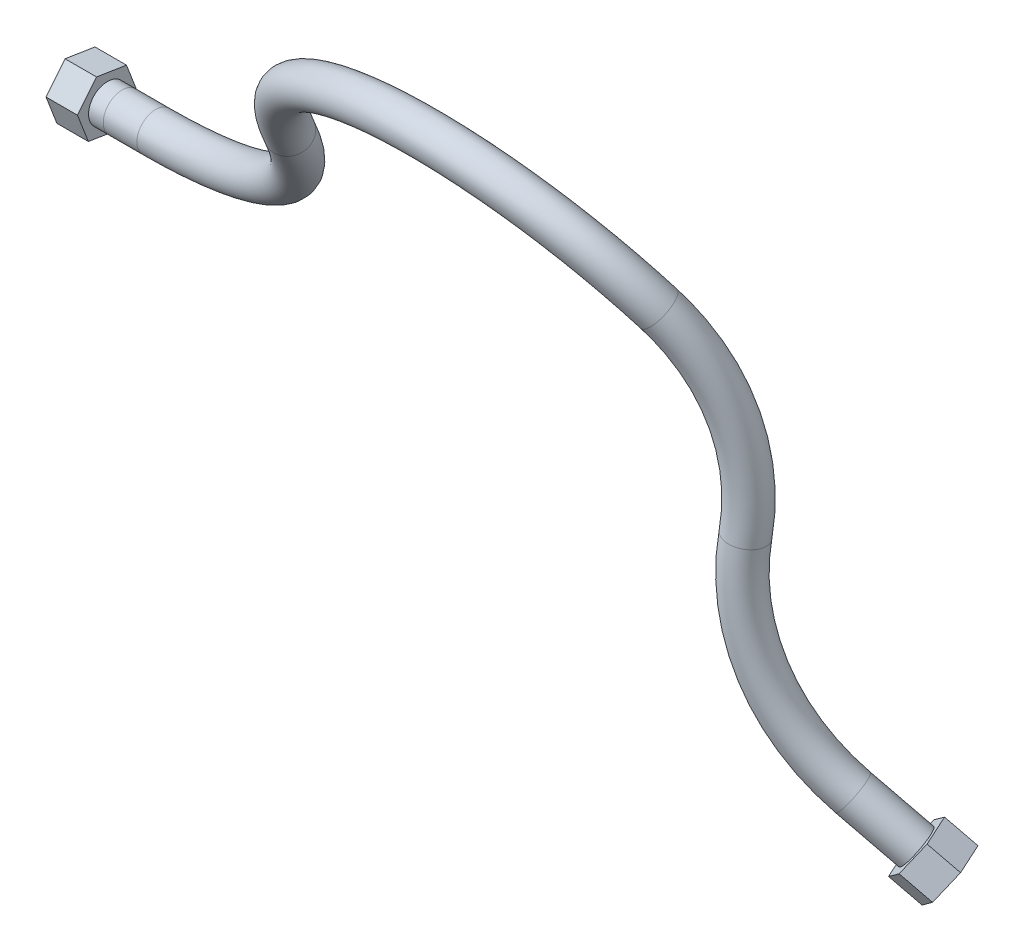
ISO-10303-21;
HEADER;
FILE_DESCRIPTION(('STEP AP214'),'2;1');
FILE_NAME('part.step','',(''),(''),'','','');
FILE_SCHEMA(('AUTOMOTIVE_DESIGN { 1 0 10303 214 1 1 1 1 }'));
ENDSEC;
DATA;
#1=APPLICATION_CONTEXT('core data for automotive mechanical design processes');
#2=APPLICATION_PROTOCOL_DEFINITION('international standard','automotive_design',2000,#1);
#3=PRODUCT_CONTEXT('',#1,'mechanical');
#4=PRODUCT('Part','Part','',(#3));
#5=PRODUCT_RELATED_PRODUCT_CATEGORY('part','',(#4));
#6=PRODUCT_DEFINITION_FORMATION('','',#4);
#7=PRODUCT_DEFINITION_CONTEXT('part definition',#1,'design');
#8=PRODUCT_DEFINITION('design','',#6,#7);
#9=PRODUCT_DEFINITION_SHAPE('','',#8);
#10=(LENGTH_UNIT() NAMED_UNIT(*) SI_UNIT(.MILLI.,.METRE.));
#11=(NAMED_UNIT(*) PLANE_ANGLE_UNIT() SI_UNIT($,.RADIAN.));
#12=(NAMED_UNIT(*) SI_UNIT($,.STERADIAN.) SOLID_ANGLE_UNIT());
#13=UNCERTAINTY_MEASURE_WITH_UNIT(LENGTH_MEASURE(1.E-05),#10,'distance_accuracy_value','');
#14=(GEOMETRIC_REPRESENTATION_CONTEXT(3) GLOBAL_UNCERTAINTY_ASSIGNED_CONTEXT((#13)) GLOBAL_UNIT_ASSIGNED_CONTEXT((#10,
#11,#12)) REPRESENTATION_CONTEXT('',''));
#15=CARTESIAN_POINT('',(0.,0.,0.));
#16=DIRECTION('',(0.,0.,1.));
#17=DIRECTION('',(1.,0.,0.));
#18=AXIS2_PLACEMENT_3D('',#15,#16,#17);
#19=CARTESIAN_POINT('',(-27.94,9.97686192185297,12.3481922236528));
#20=DIRECTION('',(0.,-0.628463743108848,-0.7778388802301));
#21=DIRECTION('',(0.,0.7778388802301,-0.628463743108848));
#22=AXIS2_PLACEMENT_3D('',#19,#20,#21);
#23=PLANE('',#22);
#24=DIRECTION('',(0.,0.7778388802301,-0.628463743108848));
#25=VECTOR('',#24,1.);
#26=CARTESIAN_POINT('',(-8.89,9.97686192185297,12.3481922236528));
#27=LINE('',#26,#25);
#28=CARTESIAN_POINT('',(-8.89,2.84762981752179,18.1083361399024));
#29=VERTEX_POINT('',#28);
#30=CARTESIAN_POINT('',(-8.89,17.1060940261842,6.5880483074033));
#31=VERTEX_POINT('',#30);
#32=EDGE_CURVE('E154',#29,#31,#27,.T.);
#33=ORIENTED_EDGE('',*,*,#32,.T.);
#34=DIRECTION('',(1.,0.,0.));
#35=VECTOR('',#34,1.);
#36=CARTESIAN_POINT('',(-27.94,17.1060940261842,6.5880483074033));
#37=LINE('',#36,#35);
#38=CARTESIAN_POINT('',(-27.94,17.1060940261842,6.5880483074033));
#39=VERTEX_POINT('',#38);
#40=EDGE_CURVE('E13',#39,#31,#37,.T.);
#41=ORIENTED_EDGE('',*,*,#40,.F.);
#42=DIRECTION('',(0.,0.7778388802301,-0.628463743108848));
#43=VECTOR('',#42,1.);
#44=CARTESIAN_POINT('',(-27.94,9.97686192185297,12.3481922236528));
#45=LINE('',#44,#43);
#46=CARTESIAN_POINT('',(-27.94,2.84762981752179,18.1083361399024));
#47=VERTEX_POINT('',#46);
#48=EDGE_CURVE('E167',#47,#39,#45,.T.);
#49=ORIENTED_EDGE('',*,*,#48,.F.);
#50=DIRECTION('',(1.,0.,0.));
#51=VECTOR('',#50,1.);
#52=CARTESIAN_POINT('',(-27.94,2.84762981752179,18.1083361399024));
#53=LINE('',#52,#51);
#54=EDGE_CURVE('E153',#47,#29,#53,.T.);
#55=ORIENTED_EDGE('',*,*,#54,.T.);
#56=EDGE_LOOP('',(#33,#41,#49,#55));
#57=FACE_BOUND('',#56,.T.);
#58=ADVANCED_FACE('F66',(#57),#23,.F.);
#59=CARTESIAN_POINT('',(-27.94,15.6822791174233,-2.4661197625479));
#60=DIRECTION('',(0.,-0.987860101884932,0.155346126774671));
#61=DIRECTION('',(0.,-0.155346126774671,-0.987860101884932));
#62=AXIS2_PLACEMENT_3D('',#59,#60,#61);
#63=PLANE('',#62);
#64=DIRECTION('',(0.,-0.155346126774671,-0.987860101884932));
#65=VECTOR('',#64,1.);
#66=CARTESIAN_POINT('',(-8.89,15.6822791174233,-2.4661197625479));
#67=LINE('',#66,#65);
#68=CARTESIAN_POINT('',(-8.89,14.2584642086624,-11.5202878324991));
#69=VERTEX_POINT('',#68);
#70=EDGE_CURVE('E157',#31,#69,#67,.T.);
#71=ORIENTED_EDGE('',*,*,#70,.T.);
#72=DIRECTION('',(1.,0.,0.));
#73=VECTOR('',#72,1.);
#74=CARTESIAN_POINT('',(-27.94,14.2584642086624,-11.5202878324991));
#75=LINE('',#74,#73);
#76=CARTESIAN_POINT('',(-27.94,14.2584642086624,-11.5202878324991));
#77=VERTEX_POINT('',#76);
#78=EDGE_CURVE('E74',#77,#69,#75,.T.);
#79=ORIENTED_EDGE('',*,*,#78,.F.);
#80=DIRECTION('',(0.,-0.155346126774671,-0.987860101884932));
#81=VECTOR('',#80,1.);
#82=CARTESIAN_POINT('',(-27.94,15.6822791174233,-2.4661197625479));
#83=LINE('',#82,#81);
#84=EDGE_CURVE('E119',#39,#77,#83,.T.);
#85=ORIENTED_EDGE('',*,*,#84,.F.);
#86=ORIENTED_EDGE('',*,*,#40,.T.);
#87=EDGE_LOOP('',(#71,#79,#85,#86));
#88=FACE_BOUND('',#87,.T.);
#89=ADVANCED_FACE('F193',(#88),#63,.F.);
#90=CARTESIAN_POINT('',(-27.94,5.70541719557035,-14.8143119862007));
#91=DIRECTION('',(0.,-0.359396358776084,0.93318500700477));
#92=DIRECTION('',(0.,-0.93318500700477,-0.359396358776084));
#93=AXIS2_PLACEMENT_3D('',#90,#91,#92);
#94=PLANE('',#93);
#95=DIRECTION('',(0.,-0.93318500700477,-0.359396358776084));
#96=VECTOR('',#95,1.);
#97=CARTESIAN_POINT('',(-8.89,5.70541719557035,-14.8143119862007));
#98=LINE('',#97,#96);
#99=CARTESIAN_POINT('',(-8.89,-2.84762981752174,-18.1083361399024));
#100=VERTEX_POINT('',#99);
#101=EDGE_CURVE('E159',#69,#100,#98,.T.);
#102=ORIENTED_EDGE('',*,*,#101,.T.);
#103=DIRECTION('',(1.,0.,0.));
#104=VECTOR('',#103,1.);
#105=CARTESIAN_POINT('',(-27.94,-2.84762981752174,-18.1083361399024));
#106=LINE('',#105,#104);
#107=CARTESIAN_POINT('',(-27.94,-2.84762981752174,-18.1083361399024));
#108=VERTEX_POINT('',#107);
#109=EDGE_CURVE('E142',#108,#100,#106,.T.);
#110=ORIENTED_EDGE('',*,*,#109,.F.);
#111=DIRECTION('',(0.,-0.93318500700477,-0.359396358776084));
#112=VECTOR('',#111,1.);
#113=CARTESIAN_POINT('',(-27.94,5.70541719557035,-14.8143119862007));
#114=LINE('',#113,#112);
#115=EDGE_CURVE('E133',#77,#108,#114,.T.);
#116=ORIENTED_EDGE('',*,*,#115,.F.);
#117=ORIENTED_EDGE('',*,*,#78,.T.);
#118=EDGE_LOOP('',(#102,#110,#116,#117));
#119=FACE_BOUND('',#118,.T.);
#120=ADVANCED_FACE('F173',(#119),#94,.F.);
#121=CARTESIAN_POINT('',(-27.94,-9.97686192185296,-12.3481922236528));
#122=DIRECTION('',(0.,0.628463743108848,0.7778388802301));
#123=DIRECTION('',(0.,-0.7778388802301,0.628463743108848));
#124=AXIS2_PLACEMENT_3D('',#121,#122,#123);
#125=PLANE('',#124);
#126=DIRECTION('',(0.,-0.7778388802301,0.628463743108848));
#127=VECTOR('',#126,1.);
#128=CARTESIAN_POINT('',(-8.89,-9.97686192185297,-12.3481922236528));
#129=LINE('',#128,#127);
#130=CARTESIAN_POINT('',(-8.89,-17.1060940261842,-6.5880483074033));
#131=VERTEX_POINT('',#130);
#132=EDGE_CURVE('E141',#100,#131,#129,.T.);
#133=ORIENTED_EDGE('',*,*,#132,.T.);
#134=DIRECTION('',(1.,0.,0.));
#135=VECTOR('',#134,1.);
#136=CARTESIAN_POINT('',(-27.94,-17.1060940261842,-6.58804830740329));
#137=LINE('',#136,#135);
#138=CARTESIAN_POINT('',(-27.94,-17.1060940261842,-6.58804830740329));
#139=VERTEX_POINT('',#138);
#140=EDGE_CURVE('E138',#139,#131,#137,.T.);
#141=ORIENTED_EDGE('',*,*,#140,.F.);
#142=DIRECTION('',(0.,-0.7778388802301,0.628463743108848));
#143=VECTOR('',#142,1.);
#144=CARTESIAN_POINT('',(-27.94,-9.97686192185296,-12.3481922236528));
#145=LINE('',#144,#143);
#146=EDGE_CURVE('E126',#108,#139,#145,.T.);
#147=ORIENTED_EDGE('',*,*,#146,.F.);
#148=ORIENTED_EDGE('',*,*,#109,.T.);
#149=EDGE_LOOP('',(#133,#141,#147,#148));
#150=FACE_BOUND('',#149,.T.);
#151=ADVANCED_FACE('F139',(#150),#125,.F.);
#152=CARTESIAN_POINT('',(-27.94,-15.6822791174233,2.46611976254791));
#153=DIRECTION('',(0.,0.987860101884932,-0.155346126774671));
#154=DIRECTION('',(0.,0.155346126774671,0.987860101884932));
#155=AXIS2_PLACEMENT_3D('',#152,#153,#154);
#156=PLANE('',#155);
#157=DIRECTION('',(0.,0.155346126774671,0.987860101884932));
#158=VECTOR('',#157,1.);
#159=CARTESIAN_POINT('',(-8.89,-15.6822791174233,2.4661197625479));
#160=LINE('',#159,#158);
#161=CARTESIAN_POINT('',(-8.89,-14.2584642086624,11.520287832499));
#162=VERTEX_POINT('',#161);
#163=EDGE_CURVE('E105',#131,#162,#160,.T.);
#164=ORIENTED_EDGE('',*,*,#163,.T.);
#165=DIRECTION('',(1.,0.,0.));
#166=VECTOR('',#165,1.);
#167=CARTESIAN_POINT('',(-27.94,-14.2584642086624,11.520287832499));
#168=LINE('',#167,#166);
#169=CARTESIAN_POINT('',(-27.94,-14.2584642086624,11.520287832499));
#170=VERTEX_POINT('',#169);
#171=EDGE_CURVE('E143',#170,#162,#168,.T.);
#172=ORIENTED_EDGE('',*,*,#171,.F.);
#173=DIRECTION('',(0.,0.155346126774671,0.987860101884932));
#174=VECTOR('',#173,1.);
#175=CARTESIAN_POINT('',(-27.94,-15.6822791174233,2.46611976254791));
#176=LINE('',#175,#174);
#177=EDGE_CURVE('E131',#139,#170,#176,.T.);
#178=ORIENTED_EDGE('',*,*,#177,.F.);
#179=ORIENTED_EDGE('',*,*,#140,.T.);
#180=EDGE_LOOP('',(#164,#172,#178,#179));
#181=FACE_BOUND('',#180,.T.);
#182=ADVANCED_FACE('F145',(#181),#156,.F.);
#183=CARTESIAN_POINT('',(-27.94,-5.70541719557032,14.8143119862007));
#184=DIRECTION('',(0.,0.359396358776084,-0.93318500700477));
#185=DIRECTION('',(0.,0.93318500700477,0.359396358776084));
#186=AXIS2_PLACEMENT_3D('',#183,#184,#185);
#187=PLANE('',#186);
#188=DIRECTION('',(0.,0.93318500700477,0.359396358776084));
#189=VECTOR('',#188,1.);
#190=CARTESIAN_POINT('',(-8.89,-5.70541719557032,14.8143119862007));
#191=LINE('',#190,#189);
#192=EDGE_CURVE('E111',#162,#29,#191,.T.);
#193=ORIENTED_EDGE('',*,*,#192,.T.);
#194=ORIENTED_EDGE('',*,*,#54,.F.);
#195=DIRECTION('',(0.,0.93318500700477,0.359396358776084));
#196=VECTOR('',#195,1.);
#197=CARTESIAN_POINT('',(-27.94,-5.70541719557032,14.8143119862007));
#198=LINE('',#197,#196);
#199=EDGE_CURVE('E82',#170,#47,#198,.T.);
#200=ORIENTED_EDGE('',*,*,#199,.F.);
#201=ORIENTED_EDGE('',*,*,#171,.T.);
#202=EDGE_LOOP('',(#193,#194,#200,#201));
#203=FACE_BOUND('',#202,.T.);
#204=ADVANCED_FACE('F181',(#203),#187,.F.);
#205=CARTESIAN_POINT('',(-27.94,0.,0.));
#206=DIRECTION('',(1.,0.,0.));
#207=DIRECTION('',(0.,1.,0.));
#208=AXIS2_PLACEMENT_3D('',#205,#206,#207);
#209=CYLINDRICAL_SURFACE('',#208,8.89000000000006);
#210=CARTESIAN_POINT('',(-27.94,0.,0.));
#211=DIRECTION('',(-1.,0.,0.));
#212=DIRECTION('',(0.,-1.,0.));
#213=AXIS2_PLACEMENT_3D('',#210,#211,#212);
#214=CIRCLE('',#213,8.89000000000006);
#215=CARTESIAN_POINT('',(-27.94,8.89000000000007,0.));
#216=VERTEX_POINT('',#215);
#217=EDGE_CURVE('E147',#216,#216,#214,.T.);
#218=CARTESIAN_POINT('',(-8.89,0.,0.));
#219=DIRECTION('',(-1.,0.,0.));
#220=DIRECTION('',(0.,-1.,0.));
#221=AXIS2_PLACEMENT_3D('',#218,#219,#220);
#222=CIRCLE('',#221,8.89000000000006);
#223=CARTESIAN_POINT('',(-8.89,8.89000000000006,0.));
#224=VERTEX_POINT('',#223);
#225=EDGE_CURVE('E164',#224,#224,#222,.T.);
#226=CARTESIAN_POINT('',(-27.94,8.89000000000007,0.));
#227=CARTESIAN_POINT('',(-27.7415625,8.89000000000007,0.));
#228=CARTESIAN_POINT('',(-27.543125,8.89000000000007,0.));
#229=CARTESIAN_POINT('',(-27.14625,8.89000000000007,0.));
#230=CARTESIAN_POINT('',(-26.9478125,8.89000000000007,0.));
#231=CARTESIAN_POINT('',(-26.5509375,8.89000000000007,0.));
#232=CARTESIAN_POINT('',(-26.3525,8.89000000000007,0.));
#233=CARTESIAN_POINT('',(-25.955625,8.89000000000007,0.));
#234=CARTESIAN_POINT('',(-25.7571875,8.89000000000007,0.));
#235=CARTESIAN_POINT('',(-25.3603125,8.89000000000007,0.));
#236=CARTESIAN_POINT('',(-25.161875,8.89000000000007,0.));
#237=CARTESIAN_POINT('',(-24.765,8.89000000000007,0.));
#238=CARTESIAN_POINT('',(-24.5665625,8.89000000000007,0.));
#239=CARTESIAN_POINT('',(-24.1696875,8.89000000000007,0.));
#240=CARTESIAN_POINT('',(-23.97125,8.89000000000007,0.));
#241=CARTESIAN_POINT('',(-23.574375,8.89000000000007,0.));
#242=CARTESIAN_POINT('',(-23.3759375,8.89000000000007,0.));
#243=CARTESIAN_POINT('',(-22.9790625,8.89000000000007,0.));
#244=CARTESIAN_POINT('',(-22.780625,8.89000000000007,0.));
#245=CARTESIAN_POINT('',(-22.38375,8.89000000000007,0.));
#246=CARTESIAN_POINT('',(-22.1853125,8.89000000000007,0.));
#247=CARTESIAN_POINT('',(-21.7884375,8.89000000000007,0.));
#248=CARTESIAN_POINT('',(-21.59,8.89000000000007,0.));
#249=CARTESIAN_POINT('',(-21.193125,8.89000000000007,0.));
#250=CARTESIAN_POINT('',(-20.9946875,8.89000000000007,0.));
#251=CARTESIAN_POINT('',(-20.5978125,8.89000000000007,0.));
#252=CARTESIAN_POINT('',(-20.399375,8.89000000000007,0.));
#253=CARTESIAN_POINT('',(-20.0025,8.89000000000007,0.));
#254=CARTESIAN_POINT('',(-19.8040625,8.89000000000007,0.));
#255=CARTESIAN_POINT('',(-19.4071875,8.89000000000007,0.));
#256=CARTESIAN_POINT('',(-19.20875,8.89000000000007,0.));
#257=CARTESIAN_POINT('',(-18.811875,8.89000000000007,0.));
#258=CARTESIAN_POINT('',(-18.6134375,8.89000000000007,0.));
#259=CARTESIAN_POINT('',(-18.2165625,8.89000000000007,0.));
#260=CARTESIAN_POINT('',(-18.018125,8.89000000000007,0.));
#261=CARTESIAN_POINT('',(-17.62125,8.89000000000007,0.));
#262=CARTESIAN_POINT('',(-17.4228125,8.89000000000007,0.));
#263=CARTESIAN_POINT('',(-17.0259375,8.89000000000007,0.));
#264=CARTESIAN_POINT('',(-16.8275,8.89000000000007,0.));
#265=CARTESIAN_POINT('',(-16.430625,8.89000000000007,0.));
#266=CARTESIAN_POINT('',(-16.2321875,8.89000000000007,0.));
#267=CARTESIAN_POINT('',(-15.8353125,8.89000000000007,0.));
#268=CARTESIAN_POINT('',(-15.636875,8.89000000000007,0.));
#269=CARTESIAN_POINT('',(-15.24,8.89000000000007,0.));
#270=CARTESIAN_POINT('',(-15.0415625,8.89000000000007,0.));
#271=CARTESIAN_POINT('',(-14.6446875,8.89000000000007,0.));
#272=CARTESIAN_POINT('',(-14.44625,8.89000000000007,0.));
#273=CARTESIAN_POINT('',(-14.049375,8.89000000000007,0.));
#274=CARTESIAN_POINT('',(-13.8509375,8.89000000000007,0.));
#275=CARTESIAN_POINT('',(-13.4540625,8.89000000000007,0.));
#276=CARTESIAN_POINT('',(-13.255625,8.89000000000007,0.));
#277=CARTESIAN_POINT('',(-12.85875,8.89000000000007,0.));
#278=CARTESIAN_POINT('',(-12.6603125,8.89000000000006,0.));
#279=CARTESIAN_POINT('',(-12.2634375,8.89000000000006,0.));
#280=CARTESIAN_POINT('',(-12.065,8.89000000000006,0.));
#281=CARTESIAN_POINT('',(-11.668125,8.89000000000006,0.));
#282=CARTESIAN_POINT('',(-11.4696875,8.89000000000006,0.));
#283=CARTESIAN_POINT('',(-11.0728125,8.89000000000006,0.));
#284=CARTESIAN_POINT('',(-10.874375,8.89000000000006,0.));
#285=CARTESIAN_POINT('',(-10.4775,8.89000000000006,0.));
#286=CARTESIAN_POINT('',(-10.2790625,8.89000000000006,0.));
#287=CARTESIAN_POINT('',(-9.8821875,8.89000000000006,0.));
#288=CARTESIAN_POINT('',(-9.68375,8.89000000000006,0.));
#289=CARTESIAN_POINT('',(-9.286875,8.89000000000006,0.));
#290=CARTESIAN_POINT('',(-9.0884375,8.89000000000006,0.));
#291=CARTESIAN_POINT('',(-8.89,8.89000000000006,0.));
#292=B_SPLINE_CURVE_WITH_KNOTS('',3,(#226,#227,#228,#229,#230,#231,#232,#233,#234,#235,#236,
#237,#238,#239,#240,#241,#242,#243,#244,#245,#246,#247,#248,#249,#250,#251,#252,#253,#254,#255,
#256,#257,#258,#259,#260,#261,#262,#263,#264,#265,#266,#267,#268,#269,#270,#271,#272,#273,#274,
#275,#276,#277,#278,#279,#280,#281,#282,#283,#284,#285,#286,#287,#288,#289,#290,#291),
.UNSPECIFIED.,.F.,.F.,(4,2,2,2,2,2,2,2,2,2,2,2,2,2,2,2,2,2,2,2,2,2,2,2,2,2,2,2,2,2,2,2,4),(0.,
0.5953125,1.190625,1.7859375,2.38125,2.9765625,3.571875,4.1671875,4.7625,5.3578125,5.953125,
6.5484375,7.14375,7.7390625,8.334375,8.9296875,9.525,10.1203125,10.715625,11.3109375,11.90625,
12.5015625,13.096875,13.6921875,14.2875,14.8828125,15.478125,16.0734375,16.66875,17.2640625,
17.859375,18.4546875,19.05),.UNSPECIFIED.);
#293=EDGE_CURVE('BSEAM183',#216,#224,#292,.T.);
#294=ORIENTED_EDGE('',*,*,#217,.T.);
#295=ORIENTED_EDGE('',*,*,#225,.F.);
#296=ORIENTED_EDGE('',*,*,#293,.T.);
#297=ORIENTED_EDGE('',*,*,#293,.F.);
#298=EDGE_LOOP('',(#294,#296,#295,#297));
#299=FACE_BOUND('',#298,.T.);
#300=ADVANCED_FACE('F183',(#299),#209,.F.);
#301=CARTESIAN_POINT('',(-27.94,0.,0.));
#302=DIRECTION('',(-1.,0.,0.));
#303=DIRECTION('',(0.,-1.,0.));
#304=AXIS2_PLACEMENT_3D('',#301,#302,#303);
#305=PLANE('',#304);
#306=ORIENTED_EDGE('',*,*,#48,.T.);
#307=ORIENTED_EDGE('',*,*,#84,.T.);
#308=ORIENTED_EDGE('',*,*,#115,.T.);
#309=ORIENTED_EDGE('',*,*,#146,.T.);
#310=ORIENTED_EDGE('',*,*,#177,.T.);
#311=ORIENTED_EDGE('',*,*,#199,.T.);
#312=EDGE_LOOP('',(#306,#307,#308,#309,#310,#311));
#313=FACE_BOUND('',#312,.T.);
#314=ORIENTED_EDGE('',*,*,#217,.F.);
#315=EDGE_LOOP('',(#314));
#316=FACE_BOUND('',#315,.T.);
#317=ADVANCED_FACE('F128',(#313,#316),#305,.T.);
#318=CARTESIAN_POINT('',(-8.89,0.,0.));
#319=DIRECTION('',(-1.,0.,0.));
#320=DIRECTION('',(0.,-1.,0.));
#321=AXIS2_PLACEMENT_3D('',#318,#319,#320);
#322=PLANE('',#321);
#323=ORIENTED_EDGE('',*,*,#32,.F.);
#324=ORIENTED_EDGE('',*,*,#192,.F.);
#325=ORIENTED_EDGE('',*,*,#163,.F.);
#326=ORIENTED_EDGE('',*,*,#132,.F.);
#327=ORIENTED_EDGE('',*,*,#101,.F.);
#328=ORIENTED_EDGE('',*,*,#70,.F.);
#329=EDGE_LOOP('',(#323,#324,#325,#326,#327,#328));
#330=FACE_BOUND('',#329,.T.);
#331=ORIENTED_EDGE('',*,*,#225,.T.);
#332=EDGE_LOOP('',(#331));
#333=FACE_BOUND('',#332,.T.);
#334=ADVANCED_FACE('F176',(#330,#333),#322,.F.);
#335=CLOSED_SHELL('',(#58,#89,#120,#151,#182,#204,#300,#317,#334));
#336=MANIFOLD_SOLID_BREP('B2',#335);
#337=CARTESIAN_POINT('',(310.326994027721,-268.221765341922,-156.076672885941));
#338=DIRECTION('',(0.707106781186546,-0.61116639153266,-0.355634140460319));
#339=DIRECTION('',(0.653915985537705,0.756567170751052,0.));
#340=AXIS2_PLACEMENT_3D('',#337,#338,#339);
#341=PLANE('',#340);
#342=DIRECTION('',(-0.70710269123671,-0.60945225321593,-0.358571799080503));
#343=VECTOR('',#342,1.);
#344=CARTESIAN_POINT('',(532.663132098578,-126.528104779735,42.4897178786835));
#345=LINE('',#344,#343);
#346=CARTESIAN_POINT('',(532.663132098578,-126.528104779735,42.4897178786835));
#347=VERTEX_POINT('',#346);
#348=CARTESIAN_POINT('',(519.701323848693,-137.6998954426,35.9167844687303));
#349=VERTEX_POINT('',#348);
#350=EDGE_CURVE('E372',#347,#349,#345,.T.);
#351=ORIENTED_EDGE('',*,*,#350,.T.);
#352=DIRECTION('',(-0.351468550776386,0.132632644520764,-0.926756947329005));
#353=VECTOR('',#352,1.);
#354=CARTESIAN_POINT('',(519.701323848693,-137.6998954426,35.9167844687303));
#355=LINE('',#354,#353);
#356=CARTESIAN_POINT('',(513.258599167416,-135.268623539298,18.9285223755435));
#357=VERTEX_POINT('',#356);
#358=EDGE_CURVE('E330',#349,#357,#355,.T.);
#359=ORIENTED_EDGE('',*,*,#358,.T.);
#360=DIRECTION('',(0.355634140460322,0.742084897736693,-0.5681851482485));
#361=VECTOR('',#360,1.);
#362=CARTESIAN_POINT('',(513.258599167416,-135.268623539298,18.9285223755435));
#363=LINE('',#362,#361);
#364=CARTESIAN_POINT('',(519.777682736023,-121.66556097313,8.51319369230996));
#365=VERTEX_POINT('',#364);
#366=EDGE_CURVE('E343',#357,#365,#363,.T.);
#367=ORIENTED_EDGE('',*,*,#366,.T.);
#368=DIRECTION('',(0.707102691236709,0.609452253215931,0.358571799080503));
#369=VECTOR('',#368,1.);
#370=CARTESIAN_POINT('',(519.777682736023,-121.66556097313,8.51319369230996));
#371=LINE('',#370,#369);
#372=CARTESIAN_POINT('',(532.739490985907,-110.493770310265,15.0861271022631));
#373=VERTEX_POINT('',#372);
#374=EDGE_CURVE('E337',#365,#373,#371,.T.);
#375=ORIENTED_EDGE('',*,*,#374,.T.);
#376=DIRECTION('',(0.351468550776389,-0.132632644520763,0.926756947329004));
#377=VECTOR('',#376,1.);
#378=CARTESIAN_POINT('',(532.739490985907,-110.493770310265,15.0861271022631));
#379=LINE('',#378,#377);
#380=CARTESIAN_POINT('',(539.182215667185,-112.925042213568,32.07438919545));
#381=VERTEX_POINT('',#380);
#382=EDGE_CURVE('E341',#373,#381,#379,.T.);
#383=ORIENTED_EDGE('',*,*,#382,.T.);
#384=DIRECTION('',(-0.355634140460324,-0.742084897736692,0.5681851482485));
#385=VECTOR('',#384,1.);
#386=CARTESIAN_POINT('',(539.182215667185,-112.925042213568,32.07438919545));
#387=LINE('',#386,#385);
#388=EDGE_CURVE('E293',#381,#347,#387,.T.);
#389=ORIENTED_EDGE('',*,*,#388,.T.);
#390=EDGE_LOOP('',(#351,#359,#367,#375,#383,#389));
#391=FACE_BOUND('',#390,.T.);
#392=CARTESIAN_POINT('',(526.2204074173,-124.096832876433,25.5014557854967));
#393=DIRECTION('',(0.707106781186546,-0.611166391532659,-0.355634140460321));
#394=DIRECTION('',(0.653915985537705,0.756567170751053,0.));
#395=AXIS2_PLACEMENT_3D('',#392,#393,#394);
#396=CIRCLE('',#395,8.89000000000008);
#397=CARTESIAN_POINT('',(532.033720528731,-117.370950728456,25.5014557854967));
#398=VERTEX_POINT('',#397);
#399=EDGE_CURVE('E365',#398,#398,#396,.T.);
#400=ORIENTED_EDGE('',*,*,#399,.F.);
#401=EDGE_LOOP('',(#400));
#402=FACE_BOUND('',#401,.T.);
#403=ADVANCED_FACE('F276',(#391,#402),#341,.T.);
#404=CARTESIAN_POINT('',(296.856609846118,-256.579045583225,-149.301842510172));
#405=DIRECTION('',(0.707106781186546,-0.61116639153266,-0.355634140460319));
#406=DIRECTION('',(0.653915985537705,0.756567170751052,0.));
#407=AXIS2_PLACEMENT_3D('',#404,#405,#406);
#408=PLANE('',#407);
#409=DIRECTION('',(-0.70710269123671,-0.60945225321593,-0.358571799080503));
#410=VECTOR('',#409,1.);
#411=CARTESIAN_POINT('',(519.192747916974,-114.885385021038,49.2645482544526));
#412=LINE('',#411,#410);
#413=CARTESIAN_POINT('',(519.192747916974,-114.885385021038,49.2645482544526));
#414=VERTEX_POINT('',#413);
#415=CARTESIAN_POINT('',(506.230939667089,-126.057175683903,42.6916148444994));
#416=VERTEX_POINT('',#415);
#417=EDGE_CURVE('E361',#414,#416,#412,.T.);
#418=ORIENTED_EDGE('',*,*,#417,.F.);
#419=DIRECTION('',(-0.355634140460324,-0.742084897736692,0.5681851482485));
#420=VECTOR('',#419,1.);
#421=CARTESIAN_POINT('',(525.711831485581,-101.282322454871,38.8492195712191));
#422=LINE('',#421,#420);
#423=CARTESIAN_POINT('',(525.711831485581,-101.282322454871,38.8492195712191));
#424=VERTEX_POINT('',#423);
#425=EDGE_CURVE('E322',#424,#414,#422,.T.);
#426=ORIENTED_EDGE('',*,*,#425,.F.);
#427=DIRECTION('',(0.351468550776389,-0.132632644520763,0.926756947329004));
#428=VECTOR('',#427,1.);
#429=CARTESIAN_POINT('',(519.269106804304,-98.8510505515683,21.8609574780323));
#430=LINE('',#429,#428);
#431=CARTESIAN_POINT('',(519.269106804304,-98.8510505515683,21.8609574780323));
#432=VERTEX_POINT('',#431);
#433=EDGE_CURVE('E316',#432,#424,#430,.T.);
#434=ORIENTED_EDGE('',*,*,#433,.F.);
#435=DIRECTION('',(0.707102691236709,0.609452253215931,0.358571799080503));
#436=VECTOR('',#435,1.);
#437=CARTESIAN_POINT('',(506.307298554419,-110.022841214433,15.2880240680791));
#438=LINE('',#437,#436);
#439=CARTESIAN_POINT('',(506.307298554419,-110.022841214433,15.2880240680791));
#440=VERTEX_POINT('',#439);
#441=EDGE_CURVE('E351',#440,#432,#438,.T.);
#442=ORIENTED_EDGE('',*,*,#441,.F.);
#443=DIRECTION('',(0.355634140460322,0.742084897736693,-0.5681851482485));
#444=VECTOR('',#443,1.);
#445=CARTESIAN_POINT('',(499.788214985812,-123.625903780601,25.7033527513126));
#446=LINE('',#445,#444);
#447=CARTESIAN_POINT('',(499.788214985812,-123.625903780601,25.7033527513126));
#448=VERTEX_POINT('',#447);
#449=EDGE_CURVE('E367',#448,#440,#446,.T.);
#450=ORIENTED_EDGE('',*,*,#449,.F.);
#451=DIRECTION('',(-0.351468550776386,0.132632644520764,-0.926756947329005));
#452=VECTOR('',#451,1.);
#453=CARTESIAN_POINT('',(506.230939667089,-126.057175683903,42.6916148444994));
#454=LINE('',#453,#452);
#455=EDGE_CURVE('E364',#416,#448,#454,.T.);
#456=ORIENTED_EDGE('',*,*,#455,.F.);
#457=EDGE_LOOP('',(#418,#426,#434,#442,#450,#456));
#458=FACE_BOUND('',#457,.T.);
#459=CARTESIAN_POINT('',(512.750023235697,-112.454113117736,32.2762861612659));
#460=DIRECTION('',(0.707106781186546,-0.611166391532659,-0.355634140460321));
#461=DIRECTION('',(0.653915985537705,0.756567170751053,0.));
#462=AXIS2_PLACEMENT_3D('',#459,#460,#461);
#463=CIRCLE('',#462,8.89000000000008);
#464=CARTESIAN_POINT('',(518.563336347127,-105.728230969759,32.2762861612659));
#465=VERTEX_POINT('',#464);
#466=EDGE_CURVE('E465',#465,#465,#463,.T.);
#467=ORIENTED_EDGE('',*,*,#466,.T.);
#468=EDGE_LOOP('',(#467));
#469=FACE_BOUND('',#468,.T.);
#470=ADVANCED_FACE('F381',(#458,#469),#408,.F.);
#471=CARTESIAN_POINT('',(532.663132098578,-126.528104779735,42.4897178786835));
#472=DIRECTION('',(0.00240500432535133,0.50501840848723,-0.863105221304575));
#473=DIRECTION('',(0.,0.863107717435471,0.50501986901837));
#474=AXIS2_PLACEMENT_3D('',#471,#472,#473);
#475=PLANE('',#474);
#476=ORIENTED_EDGE('',*,*,#417,.T.);
#477=DIRECTION('',(-0.707106781186546,0.611166391532659,0.355634140460321));
#478=VECTOR('',#477,1.);
#479=CARTESIAN_POINT('',(519.701323848693,-137.6998954426,35.9167844687303));
#480=LINE('',#479,#478);
#481=EDGE_CURVE('E64',#349,#416,#480,.T.);
#482=ORIENTED_EDGE('',*,*,#481,.F.);
#483=ORIENTED_EDGE('',*,*,#350,.F.);
#484=DIRECTION('',(-0.707106781186546,0.611166391532659,0.355634140460321));
#485=VECTOR('',#484,1.);
#486=CARTESIAN_POINT('',(532.663132098578,-126.528104779735,42.4897178786835));
#487=LINE('',#486,#485);
#488=EDGE_CURVE('E357',#347,#414,#487,.T.);
#489=ORIENTED_EDGE('',*,*,#488,.T.);
#490=EDGE_LOOP('',(#476,#482,#483,#489));
#491=FACE_BOUND('',#490,.T.);
#492=ADVANCED_FACE('F278',(#491),#475,.F.);
#493=CARTESIAN_POINT('',(519.701323848693,-137.6998954426,35.9167844687303));
#494=DIRECTION('',(0.613571395858011,0.780310337922276,-0.12102032356788));
#495=DIRECTION('',(-0.786088061901664,0.618114519272671,0.));
#496=AXIS2_PLACEMENT_3D('',#493,#494,#495);
#497=PLANE('',#496);
#498=ORIENTED_EDGE('',*,*,#455,.T.);
#499=DIRECTION('',(-0.707106781186546,0.611166391532659,0.355634140460321));
#500=VECTOR('',#499,1.);
#501=CARTESIAN_POINT('',(513.258599167416,-135.268623539298,18.9285223755435));
#502=LINE('',#501,#500);
#503=EDGE_CURVE('E285',#357,#448,#502,.T.);
#504=ORIENTED_EDGE('',*,*,#503,.F.);
#505=ORIENTED_EDGE('',*,*,#358,.F.);
#506=ORIENTED_EDGE('',*,*,#481,.T.);
#507=EDGE_LOOP('',(#498,#504,#505,#506));
#508=FACE_BOUND('',#507,.T.);
#509=ADVANCED_FACE('F406',(#508),#497,.F.);
#510=CARTESIAN_POINT('',(513.258599167416,-135.268623539298,18.9285223755435));
#511=DIRECTION('',(0.611166391532659,0.275291929435045,0.742084897736694));
#512=DIRECTION('',(0.771911015880771,0.,-0.635730590393381));
#513=AXIS2_PLACEMENT_3D('',#510,#511,#512);
#514=PLANE('',#513);
#515=ORIENTED_EDGE('',*,*,#449,.T.);
#516=DIRECTION('',(-0.707106781186546,0.611166391532659,0.355634140460321));
#517=VECTOR('',#516,1.);
#518=CARTESIAN_POINT('',(519.777682736023,-121.66556097313,8.51319369230996));
#519=LINE('',#518,#517);
#520=EDGE_CURVE('E352',#365,#440,#519,.T.);
#521=ORIENTED_EDGE('',*,*,#520,.F.);
#522=ORIENTED_EDGE('',*,*,#366,.F.);
#523=ORIENTED_EDGE('',*,*,#503,.T.);
#524=EDGE_LOOP('',(#515,#521,#522,#523));
#525=FACE_BOUND('',#524,.T.);
#526=ADVANCED_FACE('F378',(#525),#514,.F.);
#527=CARTESIAN_POINT('',(519.777682736023,-121.66556097313,8.51319369230996));
#528=DIRECTION('',(-0.0024050043253506,-0.50501840848723,0.863105221304576));
#529=DIRECTION('',(0.,-0.863107717435471,-0.505019869018369));
#530=AXIS2_PLACEMENT_3D('',#527,#528,#529);
#531=PLANE('',#530);
#532=ORIENTED_EDGE('',*,*,#441,.T.);
#533=DIRECTION('',(-0.707106781186546,0.611166391532659,0.355634140460321));
#534=VECTOR('',#533,1.);
#535=CARTESIAN_POINT('',(532.739490985907,-110.493770310265,15.0861271022631));
#536=LINE('',#535,#534);
#537=EDGE_CURVE('E348',#373,#432,#536,.T.);
#538=ORIENTED_EDGE('',*,*,#537,.F.);
#539=ORIENTED_EDGE('',*,*,#374,.F.);
#540=ORIENTED_EDGE('',*,*,#520,.T.);
#541=EDGE_LOOP('',(#532,#538,#539,#540));
#542=FACE_BOUND('',#541,.T.);
#543=ADVANCED_FACE('F349',(#542),#531,.F.);
#544=CARTESIAN_POINT('',(532.739490985907,-110.493770310265,15.0861271022631));
#545=DIRECTION('',(-0.61357139585801,-0.780310337922277,0.121020323567883));
#546=DIRECTION('',(0.786088061901665,-0.61811451927267,0.));
#547=AXIS2_PLACEMENT_3D('',#544,#545,#546);
#548=PLANE('',#547);
#549=ORIENTED_EDGE('',*,*,#433,.T.);
#550=DIRECTION('',(-0.707106781186546,0.611166391532659,0.355634140460321));
#551=VECTOR('',#550,1.);
#552=CARTESIAN_POINT('',(539.182215667185,-112.925042213568,32.07438919545));
#553=LINE('',#552,#551);
#554=EDGE_CURVE('E353',#381,#424,#553,.T.);
#555=ORIENTED_EDGE('',*,*,#554,.F.);
#556=ORIENTED_EDGE('',*,*,#382,.F.);
#557=ORIENTED_EDGE('',*,*,#537,.T.);
#558=EDGE_LOOP('',(#549,#555,#556,#557));
#559=FACE_BOUND('',#558,.T.);
#560=ADVANCED_FACE('F355',(#559),#548,.F.);
#561=CARTESIAN_POINT('',(539.182215667185,-112.925042213568,32.07438919545));
#562=DIRECTION('',(-0.611166391532658,-0.275291929435044,-0.742084897736694));
#563=DIRECTION('',(-0.771911015880771,0.,0.63573059039338));
#564=AXIS2_PLACEMENT_3D('',#561,#562,#563);
#565=PLANE('',#564);
#566=ORIENTED_EDGE('',*,*,#425,.T.);
#567=ORIENTED_EDGE('',*,*,#488,.F.);
#568=ORIENTED_EDGE('',*,*,#388,.F.);
#569=ORIENTED_EDGE('',*,*,#554,.T.);
#570=EDGE_LOOP('',(#566,#567,#568,#569));
#571=FACE_BOUND('',#570,.T.);
#572=ADVANCED_FACE('F386',(#571),#565,.F.);
#573=CARTESIAN_POINT('',(526.2204074173,-124.096832876433,25.5014557854967));
#574=DIRECTION('',(-0.707106781186546,0.611166391532659,0.355634140460321));
#575=DIRECTION('',(-0.653915985537704,-0.756567170751053,0.));
#576=AXIS2_PLACEMENT_3D('',#573,#574,#575);
#577=CYLINDRICAL_SURFACE('',#576,8.89000000000008);
#578=ORIENTED_EDGE('',*,*,#399,.T.);
#579=EDGE_LOOP('',(#578));
#580=FACE_BOUND('',#579,.T.);
#581=ORIENTED_EDGE('',*,*,#466,.F.);
#582=EDGE_LOOP('',(#581));
#583=FACE_BOUND('',#582,.T.);
#584=ADVANCED_FACE('F388',(#580,#583),#577,.F.);
#585=CLOSED_SHELL('',(#403,#470,#492,#509,#526,#543,#560,#572,#584));
#586=MANIFOLD_SOLID_BREP('B7',#585);
#587=CARTESIAN_POINT('',(512.750023235696,-112.454113117736,32.2762861612658));
#588=DIRECTION('',(0.707106781186545,-0.611166391532659,-0.355634140460321));
#589=DIRECTION('',(-0.392949748655911,0.0784986479249797,-0.916203283832363));
#590=AXIS2_PLACEMENT_3D('',#587,#588,#589);
#591=PLANE('',#590);
#592=CARTESIAN_POINT('',(512.750023235696,-112.454113117736,32.2762861612658));
#593=DIRECTION('',(0.707106781186545,-0.611166391532659,-0.355634140460321));
#594=DIRECTION('',(-0.392949748655911,0.0784986479249797,-0.916203283832363));
#595=AXIS2_PLACEMENT_3D('',#592,#593,#594);
#596=CIRCLE('',#595,6.35);
#597=CARTESIAN_POINT('',(510.254792331731,-111.955646703412,26.4583953089303));
#598=VERTEX_POINT('',#597);
#599=EDGE_CURVE('E683',#598,#598,#596,.T.);
#600=ORIENTED_EDGE('',*,*,#599,.F.);
#601=EDGE_LOOP('',(#600));
#602=FACE_BOUND('',#601,.T.);
#603=CARTESIAN_POINT('',(512.750023235696,-112.454113117736,32.2762861612658));
#604=DIRECTION('',(0.707106781186545,-0.611166391532659,-0.355634140460321));
#605=DIRECTION('',(0.653915985537704,0.756567170751053,0.));
#606=AXIS2_PLACEMENT_3D('',#603,#604,#605);
#607=CIRCLE('',#606,11.43);
#608=CARTESIAN_POINT('',(520.224282950392,-103.806550356051,32.2762861612658));
#609=VERTEX_POINT('',#608);
#610=EDGE_CURVE('E492',#609,#609,#607,.T.);
#611=ORIENTED_EDGE('',*,*,#610,.T.);
#612=EDGE_LOOP('',(#611));
#613=FACE_BOUND('',#612,.T.);
#614=ADVANCED_FACE('F473',(#602,#613),#591,.T.);
#615=CARTESIAN_POINT('',(-8.89,0.,0.));
#616=DIRECTION('',(1.,0.,0.));
#617=DIRECTION('',(0.,0.,-1.));
#618=AXIS2_PLACEMENT_3D('',#615,#616,#617);
#619=PLANE('',#618);
#620=CARTESIAN_POINT('',(-8.89,0.,0.));
#621=DIRECTION('',(1.,0.,0.));
#622=DIRECTION('',(0.,0.,-1.));
#623=AXIS2_PLACEMENT_3D('',#620,#621,#622);
#624=CIRCLE('',#623,6.35);
#625=CARTESIAN_POINT('',(-8.89,0.,-6.35));
#626=VERTEX_POINT('',#625);
#627=EDGE_CURVE('E495',#626,#626,#624,.T.);
#628=ORIENTED_EDGE('',*,*,#627,.T.);
#629=EDGE_LOOP('',(#628));
#630=FACE_BOUND('',#629,.T.);
#631=CARTESIAN_POINT('',(-8.89,0.,0.));
#632=DIRECTION('',(1.,0.,0.));
#633=DIRECTION('',(0.,0.,-1.));
#634=AXIS2_PLACEMENT_3D('',#631,#632,#633);
#635=CIRCLE('',#634,11.43);
#636=CARTESIAN_POINT('',(-8.89,0.,-11.43));
#637=VERTEX_POINT('',#636);
#638=EDGE_CURVE('E275',#637,#637,#635,.T.);
#639=ORIENTED_EDGE('',*,*,#638,.F.);
#640=EDGE_LOOP('',(#639));
#641=FACE_BOUND('',#640,.T.);
#642=ADVANCED_FACE('F569',(#630,#641),#619,.F.);
#643=CARTESIAN_POINT('',(512.750023235696,-112.454113117736,32.2762861612658));
#644=DIRECTION('',(-0.707106781186546,0.611166391532659,0.355634140460321));
#645=DIRECTION('',(-0.653915985537705,-0.756567170751053,0.));
#646=AXIS2_PLACEMENT_3D('',#643,#644,#645);
#647=CYLINDRICAL_SURFACE('',#646,11.43);
#648=CARTESIAN_POINT('',(487.205434408677,-90.375419217505,45.1237487123466));
#649=DIRECTION('',(-0.707106781186546,0.611166391532659,0.355634140460321));
#650=DIRECTION('',(-0.653915985537705,-0.756567170751053,0.));
#651=AXIS2_PLACEMENT_3D('',#648,#649,#650);
#652=CIRCLE('',#651,11.43);
#653=CARTESIAN_POINT('',(481.385828350886,-99.3945277266001,49.0522047746325));
#654=VERTEX_POINT('',#653);
#655=EDGE_CURVE('E494',#654,#654,#652,.F.);
#656=ORIENTED_EDGE('',*,*,#655,.T.);
#657=EDGE_LOOP('',(#656));
#658=FACE_BOUND('',#657,.T.);
#659=ORIENTED_EDGE('',*,*,#610,.F.);
#660=EDGE_LOOP('',(#659));
#661=FACE_BOUND('',#660,.T.);
#662=ADVANCED_FACE('F572',(#658,#661),#647,.T.);
#663=CARTESIAN_POINT('',(554.088775605133,13.2790387838493,-0.0250576810733316));
#664=DIRECTION('',(-0.490677446914447,-0.0619586459366535,-0.869135644927313));
#665=DIRECTION('',(-0.870808714529296,0.,0.491621991676363));
#666=AXIS2_PLACEMENT_3D('',#663,#664,#665);
#667=TOROIDAL_SURFACE('',#666,131.362257562463,11.43);
#668=CARTESIAN_POINT('',(440.13215976714,30.1338306284744,63.1085182554527));
#669=DIRECTION('',(-0.0817390755995657,-0.989797077698495,0.116706762870231));
#670=DIRECTION('',(0.,-0.117098602533867,-0.993120293461278));
#671=AXIS2_PLACEMENT_3D('',#668,#669,#670);
#672=CIRCLE('',#671,11.43);
#673=CARTESIAN_POINT('',(430.216647174728,31.6003878752731,68.6018523861589));
#674=VERTEX_POINT('',#673);
#675=EDGE_CURVE('E499',#674,#674,#672,.T.);
#676=CARTESIAN_POINT('',(554.088775605133,13.2790387838493,-0.0250576810733316));
#677=DIRECTION('',(-0.490677446914447,-0.0619586459366535,-0.869135644927313));
#678=DIRECTION('',(-0.870808714529296,0.,0.491621991676363));
#679=AXIS2_PLACEMENT_3D('',#676,#677,#678);
#680=CIRCLE('',#679,142.792257562463);
#681=EDGE_CURVE('',#654,#674,#680,.T.);
#682=ORIENTED_EDGE('',*,*,#655,.F.);
#683=ORIENTED_EDGE('',*,*,#675,.T.);
#684=ORIENTED_EDGE('',*,*,#681,.T.);
#685=ORIENTED_EDGE('',*,*,#681,.F.);
#686=EDGE_LOOP('',(#682,#684,#683,#685));
#687=FACE_BOUND('',#686,.T.);
#688=ADVANCED_FACE('F578',(#687),#667,.T.);
#689=CARTESIAN_POINT('',(336.261577250689,47.9577856809084,141.525681082786));
#690=DIRECTION('',(0.606698272262282,0.0434877806479274,0.793741783811511));
#691=DIRECTION('',(0.794493407172488,0.,-0.607272777225731));
#692=AXIS2_PLACEMENT_3D('',#689,#690,#691);
#693=TOROIDAL_SURFACE('',#692,131.362257562462,11.43);
#694=CARTESIAN_POINT('',(407.06752472016,141.408837524227,82.2849735900969));
#695=DIRECTION('',(0.584279327306421,-0.701441004761042,-0.408164408691125));
#696=DIRECTION('',(0.768358551477212,0.640019637489227,0.));
#697=AXIS2_PLACEMENT_3D('',#694,#695,#696);
#698=CIRCLE('',#697,11.43);
#699=CARTESIAN_POINT('',(416.34357125587,147.181035429513,85.643781713471));
#700=VERTEX_POINT('',#699);
#701=EDGE_CURVE('E513',#700,#700,#698,.T.);
#702=ORIENTED_EDGE('',*,*,#701,.T.);
#703=EDGE_LOOP('',(#702));
#704=FACE_BOUND('',#703,.T.);
#705=ORIENTED_EDGE('',*,*,#675,.F.);
#706=EDGE_LOOP('',(#705));
#707=FACE_BOUND('',#706,.T.);
#708=ADVANCED_FACE('F530',(#704,#707),#693,.T.);
#709=CARTESIAN_POINT('',(293.693622617082,70.8597520151986,41.2328743044271));
#710=DIRECTION('',(0.,-0.502942624681881,0.86431979977211));
#711=DIRECTION('',(0.,-0.86431979977211,-0.502942624681881));
#712=AXIS2_PLACEMENT_3D('',#709,#710,#711);
#713=TOROIDAL_SURFACE('',#712,139.7,11.43);
#714=CARTESIAN_POINT('',(157.006811308541,95.8026140216811,55.7469794862429));
#715=DIRECTION('',(0.206573884396834,0.845677289775853,0.492094657400964));
#716=DIRECTION('',(0.,-0.50294262468188,0.864319799772111));
#717=AXIS2_PLACEMENT_3D('',#714,#715,#716);
#718=CIRCLE('',#717,11.43);
#719=CARTESIAN_POINT('',(145.823344928751,97.8433936403933,56.934497182937));
#720=VERTEX_POINT('',#719);
#721=EDGE_CURVE('E489',#720,#720,#718,.T.);
#722=CARTESIAN_POINT('',(293.693622617082,70.8597520151986,41.2328743044271));
#723=DIRECTION('',(0.,-0.502942624681881,0.86431979977211));
#724=DIRECTION('',(0.,-0.86431979977211,-0.502942624681881));
#725=AXIS2_PLACEMENT_3D('',#722,#723,#724);
#726=CIRCLE('',#725,151.13);
#727=EDGE_CURVE('',#700,#720,#726,.T.);
#728=ORIENTED_EDGE('',*,*,#701,.F.);
#729=ORIENTED_EDGE('',*,*,#721,.T.);
#730=ORIENTED_EDGE('',*,*,#727,.T.);
#731=ORIENTED_EDGE('',*,*,#727,.F.);
#732=EDGE_LOOP('',(#728,#730,#729,#731));
#733=FACE_BOUND('',#732,.T.);
#734=ADVANCED_FACE('F518',(#733),#713,.T.);
#735=CARTESIAN_POINT('',(20.3199999999999,120.745476028164,70.2610846680589));
#736=DIRECTION('',(0.,0.502942624681882,-0.86431979977211));
#737=DIRECTION('',(0.,0.86431979977211,0.502942624681882));
#738=AXIS2_PLACEMENT_3D('',#735,#736,#737);
#739=TOROIDAL_SURFACE('',#738,139.7,11.43);
#740=CARTESIAN_POINT('',(20.32,0.,0.));
#741=DIRECTION('',(1.,0.,0.));
#742=DIRECTION('',(0.,1.,0.));
#743=AXIS2_PLACEMENT_3D('',#740,#741,#742);
#744=CIRCLE('',#743,11.43);
#745=CARTESIAN_POINT('',(20.32,11.43,0.));
#746=VERTEX_POINT('',#745);
#747=EDGE_CURVE('E484',#746,#746,#744,.T.);
#748=ORIENTED_EDGE('',*,*,#747,.T.);
#749=EDGE_LOOP('',(#748));
#750=FACE_BOUND('',#749,.T.);
#751=ORIENTED_EDGE('',*,*,#721,.F.);
#752=EDGE_LOOP('',(#751));
#753=FACE_BOUND('',#752,.T.);
#754=ADVANCED_FACE('F521',(#750,#753),#739,.T.);
#755=CARTESIAN_POINT('',(20.32,0.,0.));
#756=DIRECTION('',(-1.,0.,0.));
#757=DIRECTION('',(0.,-1.,0.));
#758=AXIS2_PLACEMENT_3D('',#755,#756,#757);
#759=CYLINDRICAL_SURFACE('',#758,11.43);
#760=CARTESIAN_POINT('',(0.,0.,0.));
#761=DIRECTION('',(-1.,0.,0.));
#762=DIRECTION('',(0.,-1.,0.));
#763=AXIS2_PLACEMENT_3D('',#760,#761,#762);
#764=CIRCLE('',#763,11.43);
#765=CARTESIAN_POINT('',(0.,-11.43,0.));
#766=VERTEX_POINT('',#765);
#767=EDGE_CURVE('E480',#766,#766,#764,.F.);
#768=ORIENTED_EDGE('',*,*,#767,.T.);
#769=EDGE_LOOP('',(#768));
#770=FACE_BOUND('',#769,.T.);
#771=ORIENTED_EDGE('',*,*,#747,.F.);
#772=EDGE_LOOP('',(#771));
#773=FACE_BOUND('',#772,.T.);
#774=ADVANCED_FACE('F523',(#770,#773),#759,.T.);
#775=CARTESIAN_POINT('',(0.,0.,0.));
#776=DIRECTION('',(-1.,0.,0.));
#777=DIRECTION('',(0.,0.,1.));
#778=AXIS2_PLACEMENT_3D('',#775,#776,#777);
#779=CYLINDRICAL_SURFACE('',#778,11.43);
#780=ORIENTED_EDGE('',*,*,#638,.T.);
#781=EDGE_LOOP('',(#780));
#782=FACE_BOUND('',#781,.T.);
#783=ORIENTED_EDGE('',*,*,#767,.F.);
#784=EDGE_LOOP('',(#783));
#785=FACE_BOUND('',#784,.T.);
#786=ADVANCED_FACE('F475',(#782,#785),#779,.T.);
#787=CARTESIAN_POINT('',(512.750023235696,-112.454113117736,32.2762861612658));
#788=DIRECTION('',(-0.707106781186546,0.611166391532659,0.355634140460321));
#789=DIRECTION('',(-0.653915985537705,-0.756567170751053,0.));
#790=AXIS2_PLACEMENT_3D('',#787,#788,#789);
#791=CYLINDRICAL_SURFACE('',#790,6.35);
#792=CARTESIAN_POINT('',(487.205434408677,-90.375419217505,45.1237487123466));
#793=DIRECTION('',(0.707106781186545,-0.611166391532659,-0.355634140460321));
#794=DIRECTION('',(-0.392949748655911,0.0784986479249797,-0.916203283832363));
#795=AXIS2_PLACEMENT_3D('',#792,#793,#794);
#796=CIRCLE('',#795,6.35);
#797=CARTESIAN_POINT('',(483.972319932126,-95.3860350558914,47.3062243025056));
#798=VERTEX_POINT('',#797);
#799=EDGE_CURVE('E684',#798,#798,#796,.T.);
#800=ORIENTED_EDGE('',*,*,#799,.F.);
#801=EDGE_LOOP('',(#800));
#802=FACE_BOUND('',#801,.T.);
#803=ORIENTED_EDGE('',*,*,#599,.T.);
#804=EDGE_LOOP('',(#803));
#805=FACE_BOUND('',#804,.T.);
#806=ADVANCED_FACE('F533',(#802,#805),#791,.F.);
#807=CARTESIAN_POINT('',(554.088775605133,13.2790387838493,-0.0250576810733316));
#808=DIRECTION('',(-0.490677446914447,-0.0619586459366535,-0.869135644927313));
#809=DIRECTION('',(-0.870808714529296,0.,0.491621991676363));
#810=AXIS2_PLACEMENT_3D('',#807,#808,#809);
#811=TOROIDAL_SURFACE('',#810,131.362257562463,6.35);
#812=CARTESIAN_POINT('',(440.13215976714,30.1338306284744,63.1085182554527));
#813=DIRECTION('',(-0.0817390755995657,-0.989797077698495,0.116706762870231));
#814=DIRECTION('',(-0.329606050846918,-0.0836634613304543,-0.940404315432094));
#815=AXIS2_PLACEMENT_3D('',#812,#813,#814);
#816=CIRCLE('',#815,6.35);
#817=CARTESIAN_POINT('',(434.623541660244,30.9485846544736,66.1603705502895));
#818=VERTEX_POINT('',#817);
#819=EDGE_CURVE('E687',#818,#818,#816,.T.);
#820=CARTESIAN_POINT('',(554.088775605133,13.2790387838493,-0.0250576810733316));
#821=DIRECTION('',(-0.490677446914447,-0.0619586459366535,-0.869135644927313));
#822=DIRECTION('',(-0.870808714529296,0.,0.491621991676363));
#823=AXIS2_PLACEMENT_3D('',#820,#821,#822);
#824=CIRCLE('',#823,137.712257562463);
#825=EDGE_CURVE('',#798,#818,#824,.T.);
#826=ORIENTED_EDGE('',*,*,#799,.T.);
#827=ORIENTED_EDGE('',*,*,#819,.F.);
#828=ORIENTED_EDGE('',*,*,#825,.T.);
#829=ORIENTED_EDGE('',*,*,#825,.F.);
#830=EDGE_LOOP('',(#826,#828,#827,#829));
#831=FACE_BOUND('',#830,.T.);
#832=ADVANCED_FACE('F537',(#831),#811,.F.);
#833=CARTESIAN_POINT('',(336.261577250689,47.9577856809084,141.525681082786));
#834=DIRECTION('',(0.606698272262282,0.0434877806479274,0.793741783811511));
#835=DIRECTION('',(0.794493407172488,0.,-0.607272777225731));
#836=AXIS2_PLACEMENT_3D('',#833,#834,#835);
#837=TOROIDAL_SURFACE('',#836,131.362257562462,6.35);
#838=CARTESIAN_POINT('',(407.06752472016,141.408837524227,82.2849735900969));
#839=DIRECTION('',(0.584279327306421,-0.701441004761042,-0.408164408691125));
#840=DIRECTION('',(-0.408164408691127,0.180715135270222,-0.894842922172427));
#841=AXIS2_PLACEMENT_3D('',#838,#839,#840);
#842=CIRCLE('',#841,6.35);
#843=CARTESIAN_POINT('',(412.220883906667,144.615614138276,84.150978103083));
#844=VERTEX_POINT('',#843);
#845=EDGE_CURVE('E692',#844,#844,#842,.T.);
#846=ORIENTED_EDGE('',*,*,#845,.F.);
#847=EDGE_LOOP('',(#846));
#848=FACE_BOUND('',#847,.T.);
#849=ORIENTED_EDGE('',*,*,#819,.T.);
#850=EDGE_LOOP('',(#849));
#851=FACE_BOUND('',#850,.T.);
#852=ADVANCED_FACE('F544',(#848,#851),#837,.F.);
#853=CARTESIAN_POINT('',(293.693622617082,70.8597520151986,41.2328743044271));
#854=DIRECTION('',(0.,-0.502942624681881,0.86431979977211));
#855=DIRECTION('',(0.,-0.86431979977211,-0.502942624681881));
#856=AXIS2_PLACEMENT_3D('',#853,#854,#855);
#857=TOROIDAL_SURFACE('',#856,139.7,6.35);
#858=CARTESIAN_POINT('',(157.006811308541,95.8026140216811,55.7469794862429));
#859=DIRECTION('',(0.206573884396834,0.845677289775853,0.492094657400964));
#860=DIRECTION('',(0.492094657400965,0.344904925894412,-0.799301845519699));
#861=AXIS2_PLACEMENT_3D('',#858,#859,#860);
#862=CIRCLE('',#861,6.35);
#863=CARTESIAN_POINT('',(150.79377443088,96.9363804765213,56.4067115399619));
#864=VERTEX_POINT('',#863);
#865=EDGE_CURVE('E695',#864,#864,#862,.T.);
#866=CARTESIAN_POINT('',(293.693622617082,70.8597520151986,41.2328743044271));
#867=DIRECTION('',(0.,-0.502942624681881,0.86431979977211));
#868=DIRECTION('',(0.,-0.86431979977211,-0.502942624681881));
#869=AXIS2_PLACEMENT_3D('',#866,#867,#868);
#870=CIRCLE('',#869,146.05);
#871=EDGE_CURVE('',#844,#864,#870,.T.);
#872=ORIENTED_EDGE('',*,*,#845,.T.);
#873=ORIENTED_EDGE('',*,*,#865,.F.);
#874=ORIENTED_EDGE('',*,*,#871,.T.);
#875=ORIENTED_EDGE('',*,*,#871,.F.);
#876=EDGE_LOOP('',(#872,#874,#873,#875));
#877=FACE_BOUND('',#876,.T.);
#878=ADVANCED_FACE('F552',(#877),#857,.F.);
#879=CARTESIAN_POINT('',(20.3199999999999,120.745476028164,70.2610846680589));
#880=DIRECTION('',(0.,0.502942624681882,-0.86431979977211));
#881=DIRECTION('',(0.,0.86431979977211,0.502942624681882));
#882=AXIS2_PLACEMENT_3D('',#879,#880,#881);
#883=TOROIDAL_SURFACE('',#882,139.7,6.35);
#884=CARTESIAN_POINT('',(20.32,0.,0.));
#885=DIRECTION('',(1.,0.,0.));
#886=DIRECTION('',(0.,0.,-1.));
#887=AXIS2_PLACEMENT_3D('',#884,#885,#886);
#888=CIRCLE('',#887,6.35);
#889=CARTESIAN_POINT('',(20.32,0.,-6.34999999999998));
#890=VERTEX_POINT('',#889);
#891=EDGE_CURVE('E507',#890,#890,#888,.T.);
#892=ORIENTED_EDGE('',*,*,#891,.F.);
#893=EDGE_LOOP('',(#892));
#894=FACE_BOUND('',#893,.T.);
#895=ORIENTED_EDGE('',*,*,#865,.T.);
#896=EDGE_LOOP('',(#895));
#897=FACE_BOUND('',#896,.T.);
#898=ADVANCED_FACE('F556',(#894,#897),#883,.F.);
#899=CARTESIAN_POINT('',(20.32,0.,0.));
#900=DIRECTION('',(-1.,0.,0.));
#901=DIRECTION('',(0.,-1.,0.));
#902=AXIS2_PLACEMENT_3D('',#899,#900,#901);
#903=CYLINDRICAL_SURFACE('',#902,6.35);
#904=CARTESIAN_POINT('',(0.,0.,0.));
#905=DIRECTION('',(1.,0.,0.));
#906=DIRECTION('',(0.,0.,-1.));
#907=AXIS2_PLACEMENT_3D('',#904,#905,#906);
#908=CIRCLE('',#907,6.35);
#909=CARTESIAN_POINT('',(0.,0.,-6.35));
#910=VERTEX_POINT('',#909);
#911=EDGE_CURVE('E502',#910,#910,#908,.T.);
#912=ORIENTED_EDGE('',*,*,#911,.F.);
#913=EDGE_LOOP('',(#912));
#914=FACE_BOUND('',#913,.T.);
#915=ORIENTED_EDGE('',*,*,#891,.T.);
#916=EDGE_LOOP('',(#915));
#917=FACE_BOUND('',#916,.T.);
#918=ADVANCED_FACE('F560',(#914,#917),#903,.F.);
#919=CARTESIAN_POINT('',(0.,0.,0.));
#920=DIRECTION('',(-1.,0.,0.));
#921=DIRECTION('',(0.,0.,1.));
#922=AXIS2_PLACEMENT_3D('',#919,#920,#921);
#923=CYLINDRICAL_SURFACE('',#922,6.35);
#924=ORIENTED_EDGE('',*,*,#627,.F.);
#925=EDGE_LOOP('',(#924));
#926=FACE_BOUND('',#925,.T.);
#927=ORIENTED_EDGE('',*,*,#911,.T.);
#928=EDGE_LOOP('',(#927));
#929=FACE_BOUND('',#928,.T.);
#930=ADVANCED_FACE('F564',(#926,#929),#923,.F.);
#931=CLOSED_SHELL('',(#614,#642,#662,#688,#708,#734,#754,#774,#786,#806,#832,#852,#878,#898,
#918,#930));
#932=MANIFOLD_SOLID_BREP('B58',#931);
#933=ADVANCED_BREP_SHAPE_REPRESENTATION('',(#18,#336,#586,#932),#14);
#934=SHAPE_DEFINITION_REPRESENTATION(#9,#933);
ENDSEC;
END-ISO-10303-21;
